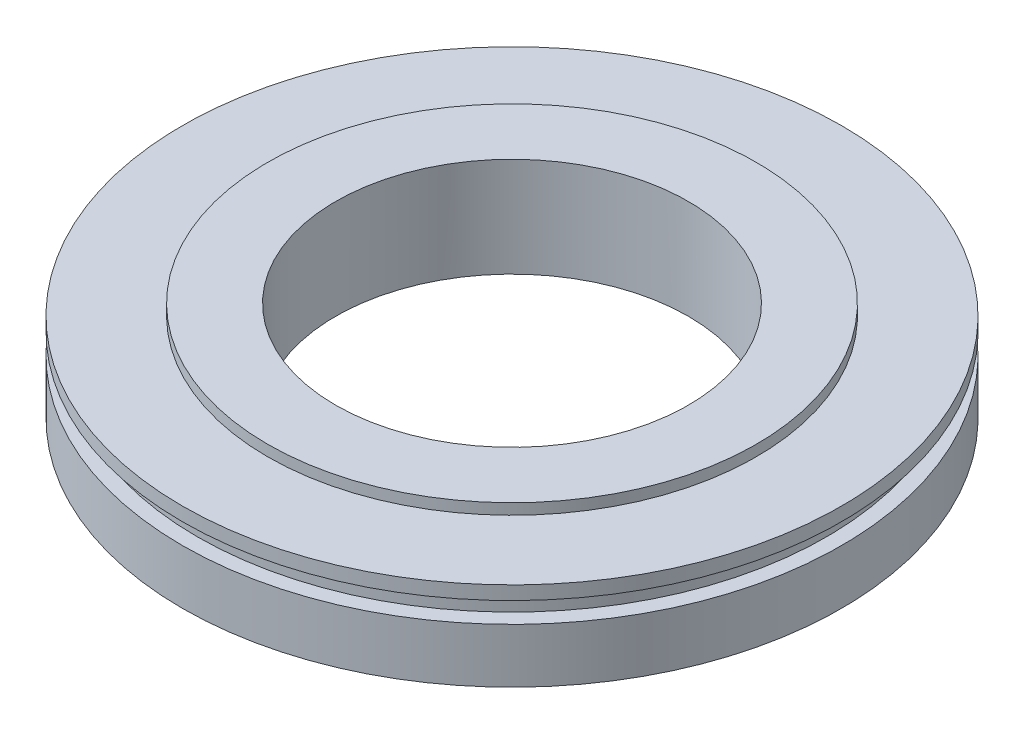
ISO-10303-21;
HEADER;
FILE_DESCRIPTION(('STEP AP214'),'2;1');
FILE_NAME('part.step','',(''),(''),'','','');
FILE_SCHEMA(('AUTOMOTIVE_DESIGN { 1 0 10303 214 1 1 1 1 }'));
ENDSEC;
DATA;
#1=APPLICATION_CONTEXT('core data for automotive mechanical design processes');
#2=APPLICATION_PROTOCOL_DEFINITION('international standard','automotive_design',2000,#1);
#3=PRODUCT_CONTEXT('',#1,'mechanical');
#4=PRODUCT('Part','Part','',(#3));
#5=PRODUCT_RELATED_PRODUCT_CATEGORY('part','',(#4));
#6=PRODUCT_DEFINITION_FORMATION('','',#4);
#7=PRODUCT_DEFINITION_CONTEXT('part definition',#1,'design');
#8=PRODUCT_DEFINITION('design','',#6,#7);
#9=PRODUCT_DEFINITION_SHAPE('','',#8);
#10=(LENGTH_UNIT() NAMED_UNIT(*) SI_UNIT(.MILLI.,.METRE.));
#11=(NAMED_UNIT(*) PLANE_ANGLE_UNIT() SI_UNIT($,.RADIAN.));
#12=(NAMED_UNIT(*) SI_UNIT($,.STERADIAN.) SOLID_ANGLE_UNIT());
#13=UNCERTAINTY_MEASURE_WITH_UNIT(LENGTH_MEASURE(1.E-05),#10,'distance_accuracy_value','');
#14=(GEOMETRIC_REPRESENTATION_CONTEXT(3) GLOBAL_UNCERTAINTY_ASSIGNED_CONTEXT((#13)) GLOBAL_UNIT_ASSIGNED_CONTEXT((#10,
#11,#12)) REPRESENTATION_CONTEXT('',''));
#15=CARTESIAN_POINT('',(0.,0.,0.));
#16=DIRECTION('',(0.,0.,1.));
#17=DIRECTION('',(1.,0.,0.));
#18=AXIS2_PLACEMENT_3D('',#15,#16,#17);
#19=CARTESIAN_POINT('',(0.,2.69408399999959,30.84068));
#20=DIRECTION('',(0.,1.,0.));
#21=DIRECTION('',(0.,0.,1.));
#22=AXIS2_PLACEMENT_3D('',#19,#20,#21);
#23=PLANE('',#22);
#24=CARTESIAN_POINT('',(0.,2.69408399999959,0.));
#25=DIRECTION('',(0.,1.,0.));
#26=DIRECTION('',(0.,0.,1.));
#27=AXIS2_PLACEMENT_3D('',#24,#25,#26);
#28=CIRCLE('',#27,30.84068);
#29=CARTESIAN_POINT('',(0.,2.69408399999959,30.84068));
#30=VERTEX_POINT('',#29);
#31=EDGE_CURVE('E58',#30,#30,#28,.T.);
#32=ORIENTED_EDGE('',*,*,#31,.T.);
#33=EDGE_LOOP('',(#32));
#34=FACE_BOUND('',#33,.T.);
#35=CARTESIAN_POINT('',(0.,2.69408399999959,0.));
#36=DIRECTION('',(0.,1.,0.));
#37=DIRECTION('',(0.,0.,1.));
#38=AXIS2_PLACEMENT_3D('',#35,#36,#37);
#39=CIRCLE('',#38,22.86);
#40=CARTESIAN_POINT('',(0.,2.69408399999959,22.86));
#41=VERTEX_POINT('',#40);
#42=EDGE_CURVE('E62',#41,#41,#39,.T.);
#43=ORIENTED_EDGE('',*,*,#42,.F.);
#44=EDGE_LOOP('',(#43));
#45=FACE_BOUND('',#44,.T.);
#46=ADVANCED_FACE('F39',(#34,#45),#23,.T.);
#47=CARTESIAN_POINT('',(0.,0.,0.));
#48=DIRECTION('',(0.,1.,0.));
#49=DIRECTION('',(0.,0.,1.));
#50=AXIS2_PLACEMENT_3D('',#47,#48,#49);
#51=CYLINDRICAL_SURFACE('',#50,16.51);
#52=CARTESIAN_POINT('',(0.,3.71008399999959,0.));
#53=DIRECTION('',(0.,1.,0.));
#54=DIRECTION('',(0.,0.,1.));
#55=AXIS2_PLACEMENT_3D('',#52,#53,#54);
#56=CIRCLE('',#55,16.51);
#57=CARTESIAN_POINT('',(0.,3.71008399999959,16.51));
#58=VERTEX_POINT('',#57);
#59=EDGE_CURVE('E65',#58,#58,#56,.T.);
#60=ORIENTED_EDGE('',*,*,#59,.T.);
#61=EDGE_LOOP('',(#60));
#62=FACE_BOUND('',#61,.T.);
#63=CARTESIAN_POINT('',(0.,-5.59993800000007,0.));
#64=DIRECTION('',(0.,-1.,0.));
#65=DIRECTION('',(0.,0.,-1.));
#66=AXIS2_PLACEMENT_3D('',#63,#64,#65);
#67=CIRCLE('',#66,16.51);
#68=CARTESIAN_POINT('',(0.,-5.59993800000007,-16.51));
#69=VERTEX_POINT('',#68);
#70=EDGE_CURVE('E73',#69,#69,#67,.T.);
#71=ORIENTED_EDGE('',*,*,#70,.T.);
#72=EDGE_LOOP('',(#71));
#73=FACE_BOUND('',#72,.T.);
#74=ADVANCED_FACE('F77',(#62,#73),#51,.F.);
#75=CARTESIAN_POINT('',(0.,0.,0.));
#76=DIRECTION('',(0.,1.,0.));
#77=DIRECTION('',(0.,0.,1.));
#78=AXIS2_PLACEMENT_3D('',#75,#76,#77);
#79=CYLINDRICAL_SURFACE('',#78,30.84068);
#80=CARTESIAN_POINT('',(0.,-0.50631600000041,0.));
#81=DIRECTION('',(0.,1.,0.));
#82=DIRECTION('',(0.,0.,1.));
#83=AXIS2_PLACEMENT_3D('',#80,#81,#82);
#84=CIRCLE('',#83,30.84068);
#85=CARTESIAN_POINT('',(0.,-0.50631600000041,30.84068));
#86=VERTEX_POINT('',#85);
#87=EDGE_CURVE('E10',#86,#86,#84,.T.);
#88=ORIENTED_EDGE('',*,*,#87,.F.);
#89=EDGE_LOOP('',(#88));
#90=FACE_BOUND('',#89,.T.);
#91=CARTESIAN_POINT('',(0.,-5.59993800000007,0.));
#92=DIRECTION('',(0.,-1.,0.));
#93=DIRECTION('',(0.,0.,-1.));
#94=AXIS2_PLACEMENT_3D('',#91,#92,#93);
#95=CIRCLE('',#94,30.84068);
#96=CARTESIAN_POINT('',(0.,-5.59993800000007,-30.84068));
#97=VERTEX_POINT('',#96);
#98=EDGE_CURVE('E70',#97,#97,#95,.T.);
#99=ORIENTED_EDGE('',*,*,#98,.F.);
#100=EDGE_LOOP('',(#99));
#101=FACE_BOUND('',#100,.T.);
#102=ADVANCED_FACE('F99',(#90,#101),#79,.T.);
#103=CARTESIAN_POINT('',(0.,-0.50631600000041,29.43479));
#104=DIRECTION('',(0.,1.,0.));
#105=DIRECTION('',(0.,0.,1.));
#106=AXIS2_PLACEMENT_3D('',#103,#104,#105);
#107=PLANE('',#106);
#108=ORIENTED_EDGE('',*,*,#87,.T.);
#109=EDGE_LOOP('',(#108));
#110=FACE_BOUND('',#109,.T.);
#111=CARTESIAN_POINT('',(0.,-0.50631600000041,0.));
#112=DIRECTION('',(0.,1.,0.));
#113=DIRECTION('',(0.,0.,1.));
#114=AXIS2_PLACEMENT_3D('',#111,#112,#113);
#115=CIRCLE('',#114,29.43479);
#116=CARTESIAN_POINT('',(0.,-0.50631600000041,29.43479));
#117=VERTEX_POINT('',#116);
#118=EDGE_CURVE('E45',#117,#117,#115,.T.);
#119=ORIENTED_EDGE('',*,*,#118,.F.);
#120=EDGE_LOOP('',(#119));
#121=FACE_BOUND('',#120,.T.);
#122=ADVANCED_FACE('F120',(#110,#121),#107,.T.);
#123=CARTESIAN_POINT('',(0.,0.,0.));
#124=DIRECTION('',(0.,1.,0.));
#125=DIRECTION('',(0.,0.,1.));
#126=AXIS2_PLACEMENT_3D('',#123,#124,#125);
#127=CYLINDRICAL_SURFACE('',#126,29.43479);
#128=ORIENTED_EDGE('',*,*,#118,.T.);
#129=EDGE_LOOP('',(#128));
#130=FACE_BOUND('',#129,.T.);
#131=CARTESIAN_POINT('',(0.,1.42408399999959,0.));
#132=DIRECTION('',(0.,1.,0.));
#133=DIRECTION('',(0.,0.,1.));
#134=AXIS2_PLACEMENT_3D('',#131,#132,#133);
#135=CIRCLE('',#134,29.43479);
#136=CARTESIAN_POINT('',(0.,1.42408399999959,29.43479));
#137=VERTEX_POINT('',#136);
#138=EDGE_CURVE('E49',#137,#137,#135,.T.);
#139=ORIENTED_EDGE('',*,*,#138,.F.);
#140=EDGE_LOOP('',(#139));
#141=FACE_BOUND('',#140,.T.);
#142=ADVANCED_FACE('F114',(#130,#141),#127,.T.);
#143=CARTESIAN_POINT('',(0.,1.42408399999959,30.84068));
#144=DIRECTION('',(0.,-1.,0.));
#145=DIRECTION('',(0.,0.,-1.));
#146=AXIS2_PLACEMENT_3D('',#143,#144,#145);
#147=PLANE('',#146);
#148=ORIENTED_EDGE('',*,*,#138,.T.);
#149=EDGE_LOOP('',(#148));
#150=FACE_BOUND('',#149,.T.);
#151=CARTESIAN_POINT('',(0.,1.42408399999959,0.));
#152=DIRECTION('',(0.,1.,0.));
#153=DIRECTION('',(0.,0.,1.));
#154=AXIS2_PLACEMENT_3D('',#151,#152,#153);
#155=CIRCLE('',#154,30.84068);
#156=CARTESIAN_POINT('',(0.,1.42408399999959,30.84068));
#157=VERTEX_POINT('',#156);
#158=EDGE_CURVE('E53',#157,#157,#155,.T.);
#159=ORIENTED_EDGE('',*,*,#158,.F.);
#160=EDGE_LOOP('',(#159));
#161=FACE_BOUND('',#160,.T.);
#162=ADVANCED_FACE('F107',(#150,#161),#147,.T.);
#163=CARTESIAN_POINT('',(0.,0.,0.));
#164=DIRECTION('',(0.,1.,0.));
#165=DIRECTION('',(0.,0.,1.));
#166=AXIS2_PLACEMENT_3D('',#163,#164,#165);
#167=CYLINDRICAL_SURFACE('',#166,30.84068);
#168=ORIENTED_EDGE('',*,*,#158,.T.);
#169=EDGE_LOOP('',(#168));
#170=FACE_BOUND('',#169,.T.);
#171=ORIENTED_EDGE('',*,*,#31,.F.);
#172=EDGE_LOOP('',(#171));
#173=FACE_BOUND('',#172,.T.);
#174=ADVANCED_FACE('F106',(#170,#173),#167,.T.);
#175=CARTESIAN_POINT('',(0.,3.71008399999959,0.));
#176=DIRECTION('',(0.,1.,0.));
#177=DIRECTION('',(0.,0.,1.));
#178=AXIS2_PLACEMENT_3D('',#175,#176,#177);
#179=PLANE('',#178);
#180=CARTESIAN_POINT('',(0.,3.71008399999959,0.));
#181=DIRECTION('',(0.,1.,0.));
#182=DIRECTION('',(0.,0.,1.));
#183=AXIS2_PLACEMENT_3D('',#180,#181,#182);
#184=CIRCLE('',#183,22.86);
#185=CARTESIAN_POINT('',(0.,3.71008399999959,22.86));
#186=VERTEX_POINT('',#185);
#187=EDGE_CURVE('E61',#186,#186,#184,.T.);
#188=ORIENTED_EDGE('',*,*,#187,.T.);
#189=EDGE_LOOP('',(#188));
#190=FACE_BOUND('',#189,.T.);
#191=ORIENTED_EDGE('',*,*,#59,.F.);
#192=EDGE_LOOP('',(#191));
#193=FACE_BOUND('',#192,.T.);
#194=ADVANCED_FACE('F88',(#190,#193),#179,.T.);
#195=CARTESIAN_POINT('',(0.,3.71008399999959,0.));
#196=DIRECTION('',(0.,-1.,0.));
#197=DIRECTION('',(0.,0.,-1.));
#198=AXIS2_PLACEMENT_3D('',#195,#196,#197);
#199=CYLINDRICAL_SURFACE('',#198,22.86);
#200=ORIENTED_EDGE('',*,*,#187,.F.);
#201=EDGE_LOOP('',(#200));
#202=FACE_BOUND('',#201,.T.);
#203=ORIENTED_EDGE('',*,*,#42,.T.);
#204=EDGE_LOOP('',(#203));
#205=FACE_BOUND('',#204,.T.);
#206=ADVANCED_FACE('F81',(#202,#205),#199,.T.);
#207=CARTESIAN_POINT('',(0.,-5.59993800000007,0.));
#208=DIRECTION('',(0.,-1.,0.));
#209=DIRECTION('',(0.,0.,-1.));
#210=AXIS2_PLACEMENT_3D('',#207,#208,#209);
#211=PLANE('',#210);
#212=ORIENTED_EDGE('',*,*,#98,.T.);
#213=EDGE_LOOP('',(#212));
#214=FACE_BOUND('',#213,.T.);
#215=ORIENTED_EDGE('',*,*,#70,.F.);
#216=EDGE_LOOP('',(#215));
#217=FACE_BOUND('',#216,.T.);
#218=ADVANCED_FACE('F79',(#214,#217),#211,.T.);
#219=CLOSED_SHELL('',(#46,#74,#102,#122,#142,#162,#174,#194,#206,#218));
#220=MANIFOLD_SOLID_BREP('B2',#219);
#221=ADVANCED_BREP_SHAPE_REPRESENTATION('',(#18,#220),#14);
#222=SHAPE_DEFINITION_REPRESENTATION(#9,#221);
ENDSEC;
END-ISO-10303-21;
